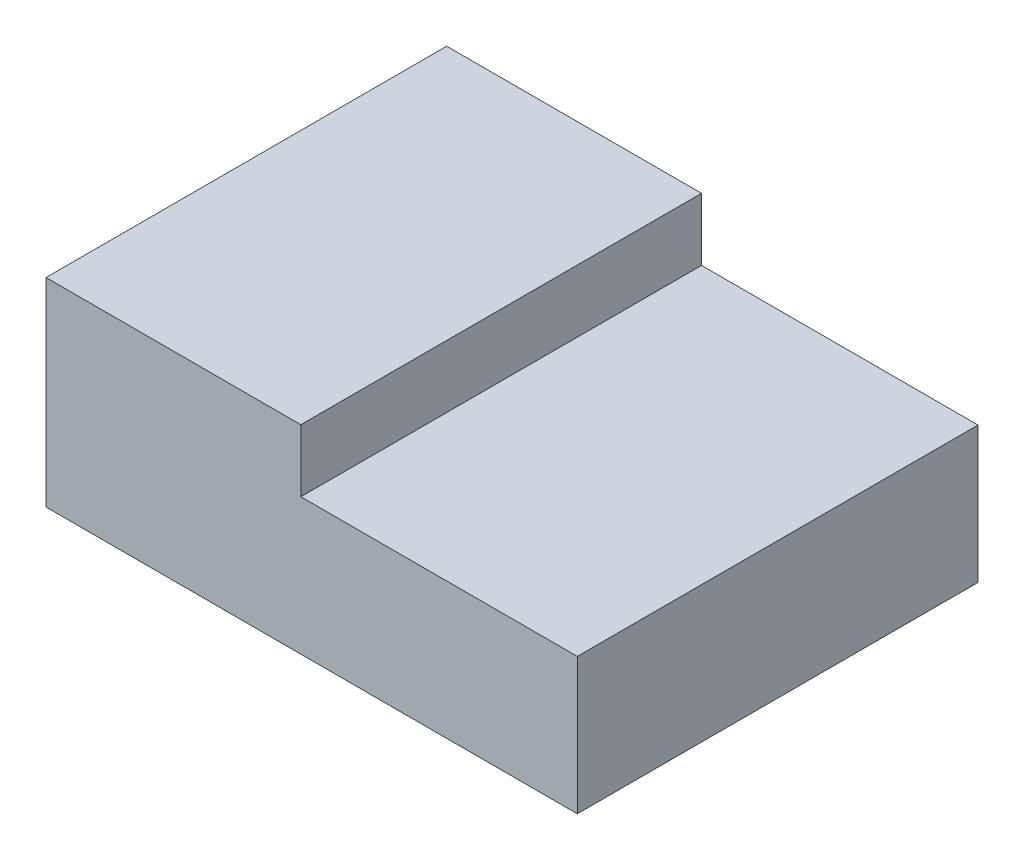
ISO-10303-21;
HEADER;
FILE_DESCRIPTION(('STEP AP214'),'2;1');
FILE_NAME('part.step','',(''),(''),'','','');
FILE_SCHEMA(('AUTOMOTIVE_DESIGN { 1 0 10303 214 1 1 1 1 }'));
ENDSEC;
DATA;
#1=APPLICATION_CONTEXT('core data for automotive mechanical design processes');
#2=APPLICATION_PROTOCOL_DEFINITION('international standard','automotive_design',2000,#1);
#3=PRODUCT_CONTEXT('',#1,'mechanical');
#4=PRODUCT('Part','Part','',(#3));
#5=PRODUCT_RELATED_PRODUCT_CATEGORY('part','',(#4));
#6=PRODUCT_DEFINITION_FORMATION('','',#4);
#7=PRODUCT_DEFINITION_CONTEXT('part definition',#1,'design');
#8=PRODUCT_DEFINITION('design','',#6,#7);
#9=PRODUCT_DEFINITION_SHAPE('','',#8);
#10=(LENGTH_UNIT() NAMED_UNIT(*) SI_UNIT(.MILLI.,.METRE.));
#11=(NAMED_UNIT(*) PLANE_ANGLE_UNIT() SI_UNIT($,.RADIAN.));
#12=(NAMED_UNIT(*) SI_UNIT($,.STERADIAN.) SOLID_ANGLE_UNIT());
#13=UNCERTAINTY_MEASURE_WITH_UNIT(LENGTH_MEASURE(1.E-05),#10,'distance_accuracy_value','');
#14=(GEOMETRIC_REPRESENTATION_CONTEXT(3) GLOBAL_UNCERTAINTY_ASSIGNED_CONTEXT((#13)) GLOBAL_UNIT_ASSIGNED_CONTEXT((#10,
#11,#12)) REPRESENTATION_CONTEXT('',''));
#15=CARTESIAN_POINT('',(0.,0.,0.));
#16=DIRECTION('',(0.,0.,1.));
#17=DIRECTION('',(1.,0.,0.));
#18=AXIS2_PLACEMENT_3D('',#15,#16,#17);
#19=CARTESIAN_POINT('',(20.85,10.7,0.));
#20=DIRECTION('',(1.,0.,0.));
#21=DIRECTION('',(0.,0.,-1.));
#22=AXIS2_PLACEMENT_3D('',#19,#20,#21);
#23=PLANE('',#22);
#24=DIRECTION('',(0.,0.,1.));
#25=VECTOR('',#24,1.);
#26=CARTESIAN_POINT('',(20.85,0.,0.));
#27=LINE('',#26,#25);
#28=CARTESIAN_POINT('',(20.85,0.,-15.725));
#29=VERTEX_POINT('',#28);
#30=CARTESIAN_POINT('',(20.85,0.,15.725));
#31=VERTEX_POINT('',#30);
#32=EDGE_CURVE('E94',#29,#31,#27,.T.);
#33=ORIENTED_EDGE('',*,*,#32,.F.);
#34=DIRECTION('',(0.,-1.,0.));
#35=VECTOR('',#34,1.);
#36=CARTESIAN_POINT('',(20.85,10.7,-15.725));
#37=LINE('',#36,#35);
#38=CARTESIAN_POINT('',(20.85,10.7,-15.725));
#39=VERTEX_POINT('',#38);
#40=EDGE_CURVE('E11',#39,#29,#37,.T.);
#41=ORIENTED_EDGE('',*,*,#40,.F.);
#42=DIRECTION('',(0.,0.,1.));
#43=VECTOR('',#42,1.);
#44=CARTESIAN_POINT('',(20.85,10.7,0.));
#45=LINE('',#44,#43);
#46=CARTESIAN_POINT('',(20.85,10.7,15.725));
#47=VERTEX_POINT('',#46);
#48=EDGE_CURVE('E93',#39,#47,#45,.T.);
#49=ORIENTED_EDGE('',*,*,#48,.T.);
#50=DIRECTION('',(0.,-1.,0.));
#51=VECTOR('',#50,1.);
#52=CARTESIAN_POINT('',(20.85,10.7,15.725));
#53=LINE('',#52,#51);
#54=EDGE_CURVE('E57',#47,#31,#53,.T.);
#55=ORIENTED_EDGE('',*,*,#54,.T.);
#56=EDGE_LOOP('',(#33,#41,#49,#55));
#57=FACE_BOUND('',#56,.T.);
#58=ADVANCED_FACE('F50',(#57),#23,.T.);
#59=CARTESIAN_POINT('',(0.,10.7,-15.725));
#60=DIRECTION('',(0.,0.,-1.));
#61=DIRECTION('',(-1.,0.,0.));
#62=AXIS2_PLACEMENT_3D('',#59,#60,#61);
#63=PLANE('',#62);
#64=DIRECTION('',(1.,0.,0.));
#65=VECTOR('',#64,1.);
#66=CARTESIAN_POINT('',(0.,0.,-15.725));
#67=LINE('',#66,#65);
#68=CARTESIAN_POINT('',(-20.85,0.,-15.725));
#69=VERTEX_POINT('',#68);
#70=EDGE_CURVE('E118',#69,#29,#67,.T.);
#71=ORIENTED_EDGE('',*,*,#70,.F.);
#72=DIRECTION('',(0.,-1.,0.));
#73=VECTOR('',#72,1.);
#74=CARTESIAN_POINT('',(-20.85,15.6,-15.725));
#75=LINE('',#74,#73);
#76=CARTESIAN_POINT('',(-20.85,15.6,-15.725));
#77=VERTEX_POINT('',#76);
#78=EDGE_CURVE('E136',#77,#69,#75,.T.);
#79=ORIENTED_EDGE('',*,*,#78,.F.);
#80=DIRECTION('',(1.,0.,0.));
#81=VECTOR('',#80,1.);
#82=CARTESIAN_POINT('',(0.,15.6,-15.725));
#83=LINE('',#82,#81);
#84=CARTESIAN_POINT('',(-0.849999999999998,15.6,-15.725));
#85=VERTEX_POINT('',#84);
#86=EDGE_CURVE('E144',#77,#85,#83,.T.);
#87=ORIENTED_EDGE('',*,*,#86,.T.);
#88=DIRECTION('',(0.,-1.,0.));
#89=VECTOR('',#88,1.);
#90=CARTESIAN_POINT('',(-0.849999999999998,15.6,-15.725));
#91=LINE('',#90,#89);
#92=CARTESIAN_POINT('',(-0.849999999999998,10.7,-15.725));
#93=VERTEX_POINT('',#92);
#94=EDGE_CURVE('E103',#85,#93,#91,.T.);
#95=ORIENTED_EDGE('',*,*,#94,.T.);
#96=DIRECTION('',(1.,0.,0.));
#97=VECTOR('',#96,1.);
#98=CARTESIAN_POINT('',(0.,10.7,-15.725));
#99=LINE('',#98,#97);
#100=EDGE_CURVE('E98',#93,#39,#99,.T.);
#101=ORIENTED_EDGE('',*,*,#100,.T.);
#102=ORIENTED_EDGE('',*,*,#40,.T.);
#103=EDGE_LOOP('',(#71,#79,#87,#95,#101,#102));
#104=FACE_BOUND('',#103,.T.);
#105=ADVANCED_FACE('F104',(#104),#63,.T.);
#106=CARTESIAN_POINT('',(0.,10.7,15.725));
#107=DIRECTION('',(0.,0.,-1.));
#108=DIRECTION('',(-1.,0.,0.));
#109=AXIS2_PLACEMENT_3D('',#106,#107,#108);
#110=PLANE('',#109);
#111=DIRECTION('',(1.,0.,0.));
#112=VECTOR('',#111,1.);
#113=CARTESIAN_POINT('',(0.,0.,15.725));
#114=LINE('',#113,#112);
#115=CARTESIAN_POINT('',(-20.85,0.,15.725));
#116=VERTEX_POINT('',#115);
#117=EDGE_CURVE('E102',#116,#31,#114,.T.);
#118=ORIENTED_EDGE('',*,*,#117,.T.);
#119=ORIENTED_EDGE('',*,*,#54,.F.);
#120=DIRECTION('',(1.,0.,0.));
#121=VECTOR('',#120,1.);
#122=CARTESIAN_POINT('',(0.,10.7,15.725));
#123=LINE('',#122,#121);
#124=CARTESIAN_POINT('',(-0.849999999999998,10.7,15.725));
#125=VERTEX_POINT('',#124);
#126=EDGE_CURVE('E62',#125,#47,#123,.T.);
#127=ORIENTED_EDGE('',*,*,#126,.F.);
#128=DIRECTION('',(0.,-1.,0.));
#129=VECTOR('',#128,1.);
#130=CARTESIAN_POINT('',(-0.849999999999998,15.6,15.725));
#131=LINE('',#130,#129);
#132=CARTESIAN_POINT('',(-0.849999999999998,15.6,15.725));
#133=VERTEX_POINT('',#132);
#134=EDGE_CURVE('E146',#133,#125,#131,.T.);
#135=ORIENTED_EDGE('',*,*,#134,.F.);
#136=DIRECTION('',(1.,0.,0.));
#137=VECTOR('',#136,1.);
#138=CARTESIAN_POINT('',(0.,15.6,15.725));
#139=LINE('',#138,#137);
#140=CARTESIAN_POINT('',(-20.85,15.6,15.725));
#141=VERTEX_POINT('',#140);
#142=EDGE_CURVE('E161',#141,#133,#139,.T.);
#143=ORIENTED_EDGE('',*,*,#142,.F.);
#144=DIRECTION('',(0.,-1.,0.));
#145=VECTOR('',#144,1.);
#146=CARTESIAN_POINT('',(-20.85,15.6,15.725));
#147=LINE('',#146,#145);
#148=EDGE_CURVE('E120',#141,#116,#147,.T.);
#149=ORIENTED_EDGE('',*,*,#148,.T.);
#150=EDGE_LOOP('',(#118,#119,#127,#135,#143,#149));
#151=FACE_BOUND('',#150,.T.);
#152=ADVANCED_FACE('F128',(#151),#110,.F.);
#153=CARTESIAN_POINT('',(0.,10.7,0.));
#154=DIRECTION('',(0.,1.,0.));
#155=DIRECTION('',(0.,0.,1.));
#156=AXIS2_PLACEMENT_3D('',#153,#154,#155);
#157=PLANE('',#156);
#158=ORIENTED_EDGE('',*,*,#48,.F.);
#159=ORIENTED_EDGE('',*,*,#100,.F.);
#160=DIRECTION('',(0.,0.,1.));
#161=VECTOR('',#160,1.);
#162=CARTESIAN_POINT('',(-0.849999999999998,10.7,0.));
#163=LINE('',#162,#161);
#164=EDGE_CURVE('E81',#93,#125,#163,.T.);
#165=ORIENTED_EDGE('',*,*,#164,.T.);
#166=ORIENTED_EDGE('',*,*,#126,.T.);
#167=EDGE_LOOP('',(#158,#159,#165,#166));
#168=FACE_BOUND('',#167,.T.);
#169=ADVANCED_FACE('F97',(#168),#157,.T.);
#170=CARTESIAN_POINT('',(0.,0.,0.));
#171=DIRECTION('',(0.,1.,0.));
#172=DIRECTION('',(0.,0.,1.));
#173=AXIS2_PLACEMENT_3D('',#170,#171,#172);
#174=PLANE('',#173);
#175=ORIENTED_EDGE('',*,*,#32,.T.);
#176=ORIENTED_EDGE('',*,*,#117,.F.);
#177=DIRECTION('',(0.,0.,1.));
#178=VECTOR('',#177,1.);
#179=CARTESIAN_POINT('',(-20.85,0.,0.));
#180=LINE('',#179,#178);
#181=EDGE_CURVE('E132',#69,#116,#180,.T.);
#182=ORIENTED_EDGE('',*,*,#181,.F.);
#183=ORIENTED_EDGE('',*,*,#70,.T.);
#184=EDGE_LOOP('',(#175,#176,#182,#183));
#185=FACE_BOUND('',#184,.T.);
#186=ADVANCED_FACE('F133',(#185),#174,.F.);
#187=CARTESIAN_POINT('',(-0.849999999999998,15.6,0.));
#188=DIRECTION('',(1.,0.,0.));
#189=DIRECTION('',(0.,0.,-1.));
#190=AXIS2_PLACEMENT_3D('',#187,#188,#189);
#191=PLANE('',#190);
#192=ORIENTED_EDGE('',*,*,#164,.F.);
#193=ORIENTED_EDGE('',*,*,#94,.F.);
#194=DIRECTION('',(0.,0.,1.));
#195=VECTOR('',#194,1.);
#196=CARTESIAN_POINT('',(-0.849999999999998,15.6,0.));
#197=LINE('',#196,#195);
#198=EDGE_CURVE('E153',#85,#133,#197,.T.);
#199=ORIENTED_EDGE('',*,*,#198,.T.);
#200=ORIENTED_EDGE('',*,*,#134,.T.);
#201=EDGE_LOOP('',(#192,#193,#199,#200));
#202=FACE_BOUND('',#201,.T.);
#203=ADVANCED_FACE('F159',(#202),#191,.T.);
#204=CARTESIAN_POINT('',(-20.85,15.6,0.));
#205=DIRECTION('',(1.,0.,0.));
#206=DIRECTION('',(0.,0.,-1.));
#207=AXIS2_PLACEMENT_3D('',#204,#205,#206);
#208=PLANE('',#207);
#209=ORIENTED_EDGE('',*,*,#181,.T.);
#210=ORIENTED_EDGE('',*,*,#148,.F.);
#211=DIRECTION('',(0.,0.,1.));
#212=VECTOR('',#211,1.);
#213=CARTESIAN_POINT('',(-20.85,15.6,0.));
#214=LINE('',#213,#212);
#215=EDGE_CURVE('E145',#77,#141,#214,.T.);
#216=ORIENTED_EDGE('',*,*,#215,.F.);
#217=ORIENTED_EDGE('',*,*,#78,.T.);
#218=EDGE_LOOP('',(#209,#210,#216,#217));
#219=FACE_BOUND('',#218,.T.);
#220=ADVANCED_FACE('F139',(#219),#208,.F.);
#221=CARTESIAN_POINT('',(0.,15.6,0.));
#222=DIRECTION('',(0.,1.,0.));
#223=DIRECTION('',(0.,0.,1.));
#224=AXIS2_PLACEMENT_3D('',#221,#222,#223);
#225=PLANE('',#224);
#226=ORIENTED_EDGE('',*,*,#215,.T.);
#227=ORIENTED_EDGE('',*,*,#142,.T.);
#228=ORIENTED_EDGE('',*,*,#198,.F.);
#229=ORIENTED_EDGE('',*,*,#86,.F.);
#230=EDGE_LOOP('',(#226,#227,#228,#229));
#231=FACE_BOUND('',#230,.T.);
#232=ADVANCED_FACE('F166',(#231),#225,.T.);
#233=CLOSED_SHELL('',(#58,#105,#152,#169,#186,#203,#220,#232));
#234=MANIFOLD_SOLID_BREP('B2',#233);
#235=ADVANCED_BREP_SHAPE_REPRESENTATION('',(#18,#234),#14);
#236=SHAPE_DEFINITION_REPRESENTATION(#9,#235);
ENDSEC;
END-ISO-10303-21;
